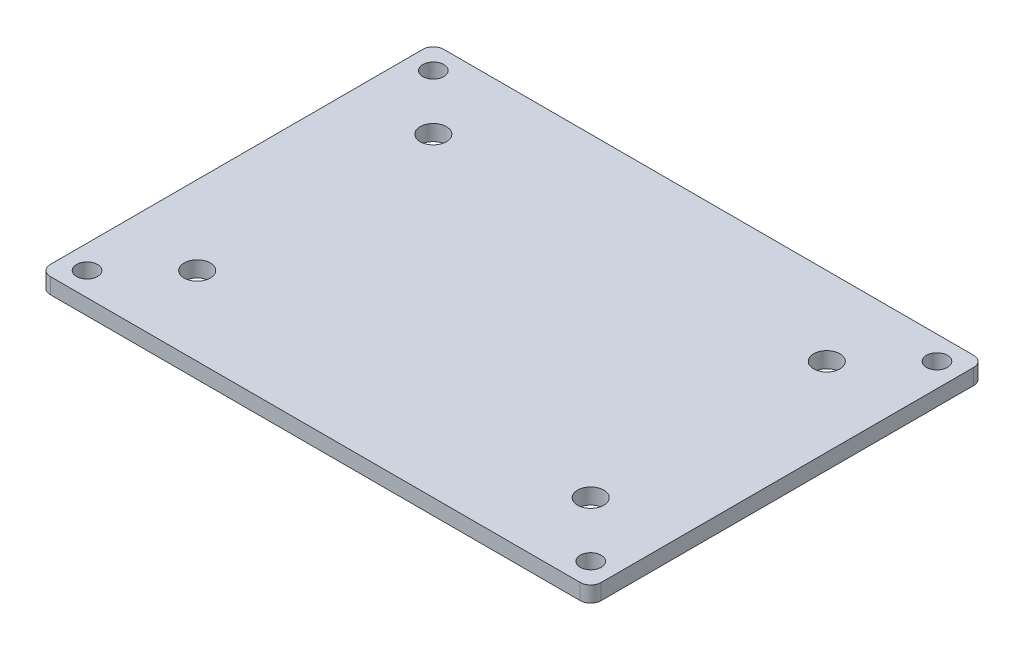
ISO-10303-21;
HEADER;
FILE_DESCRIPTION(('STEP AP214'),'2;1');
FILE_NAME('part.step','',(''),(''),'','','');
FILE_SCHEMA(('AUTOMOTIVE_DESIGN { 1 0 10303 214 1 1 1 1 }'));
ENDSEC;
DATA;
#1=APPLICATION_CONTEXT('core data for automotive mechanical design processes');
#2=APPLICATION_PROTOCOL_DEFINITION('international standard','automotive_design',2000,#1);
#3=PRODUCT_CONTEXT('',#1,'mechanical');
#4=PRODUCT('Part','Part','',(#3));
#5=PRODUCT_RELATED_PRODUCT_CATEGORY('part','',(#4));
#6=PRODUCT_DEFINITION_FORMATION('','',#4);
#7=PRODUCT_DEFINITION_CONTEXT('part definition',#1,'design');
#8=PRODUCT_DEFINITION('design','',#6,#7);
#9=PRODUCT_DEFINITION_SHAPE('','',#8);
#10=(LENGTH_UNIT() NAMED_UNIT(*) SI_UNIT(.MILLI.,.METRE.));
#11=(NAMED_UNIT(*) PLANE_ANGLE_UNIT() SI_UNIT($,.RADIAN.));
#12=(NAMED_UNIT(*) SI_UNIT($,.STERADIAN.) SOLID_ANGLE_UNIT());
#13=UNCERTAINTY_MEASURE_WITH_UNIT(LENGTH_MEASURE(1.E-05),#10,'distance_accuracy_value','');
#14=(GEOMETRIC_REPRESENTATION_CONTEXT(3) GLOBAL_UNCERTAINTY_ASSIGNED_CONTEXT((#13)) GLOBAL_UNIT_ASSIGNED_CONTEXT((#10,
#11,#12)) REPRESENTATION_CONTEXT('',''));
#15=CARTESIAN_POINT('',(0.,0.,0.));
#16=DIRECTION('',(0.,0.,1.));
#17=DIRECTION('',(1.,0.,0.));
#18=AXIS2_PLACEMENT_3D('',#15,#16,#17);
#19=CARTESIAN_POINT('',(0.,3.,0.));
#20=DIRECTION('',(0.,-1.,0.));
#21=DIRECTION('',(0.,0.,-1.));
#22=AXIS2_PLACEMENT_3D('',#19,#20,#21);
#23=PLANE('',#22);
#24=CARTESIAN_POINT('',(-37.5,3.,-22.5));
#25=DIRECTION('',(0.,1.,0.));
#26=DIRECTION('',(0.,0.,1.));
#27=AXIS2_PLACEMENT_3D('',#24,#25,#26);
#28=CIRCLE('',#27,2.5);
#29=CARTESIAN_POINT('',(-37.5,3.,-20.));
#30=VERTEX_POINT('',#29);
#31=EDGE_CURVE('E431',#30,#30,#28,.T.);
#32=ORIENTED_EDGE('',*,*,#31,.F.);
#33=EDGE_LOOP('',(#32));
#34=FACE_BOUND('',#33,.T.);
#35=CARTESIAN_POINT('',(37.5,3.,-22.5));
#36=DIRECTION('',(0.,1.,0.));
#37=DIRECTION('',(0.,0.,1.));
#38=AXIS2_PLACEMENT_3D('',#35,#36,#37);
#39=CIRCLE('',#38,2.5);
#40=CARTESIAN_POINT('',(37.5,3.,-20.));
#41=VERTEX_POINT('',#40);
#42=EDGE_CURVE('E433',#41,#41,#39,.T.);
#43=ORIENTED_EDGE('',*,*,#42,.F.);
#44=EDGE_LOOP('',(#43));
#45=FACE_BOUND('',#44,.T.);
#46=CARTESIAN_POINT('',(37.5,3.,22.5));
#47=DIRECTION('',(0.,1.,0.));
#48=DIRECTION('',(0.,0.,1.));
#49=AXIS2_PLACEMENT_3D('',#46,#47,#48);
#50=CIRCLE('',#49,2.5);
#51=CARTESIAN_POINT('',(37.5,3.,25.));
#52=VERTEX_POINT('',#51);
#53=EDGE_CURVE('E437',#52,#52,#50,.T.);
#54=ORIENTED_EDGE('',*,*,#53,.F.);
#55=EDGE_LOOP('',(#54));
#56=FACE_BOUND('',#55,.T.);
#57=CARTESIAN_POINT('',(-37.5,3.,22.5));
#58=DIRECTION('',(0.,1.,0.));
#59=DIRECTION('',(0.,0.,1.));
#60=AXIS2_PLACEMENT_3D('',#57,#58,#59);
#61=CIRCLE('',#60,2.5);
#62=CARTESIAN_POINT('',(-37.5,3.,25.));
#63=VERTEX_POINT('',#62);
#64=EDGE_CURVE('E187',#63,#63,#61,.T.);
#65=ORIENTED_EDGE('',*,*,#64,.F.);
#66=EDGE_LOOP('',(#65));
#67=FACE_BOUND('',#66,.T.);
#68=DIRECTION('',(-1.,0.,0.));
#69=VECTOR('',#68,1.);
#70=CARTESIAN_POINT('',(-52.5,3.,-37.5));
#71=LINE('',#70,#69);
#72=CARTESIAN_POINT('',(50.5,3.,-37.5));
#73=VERTEX_POINT('',#72);
#74=CARTESIAN_POINT('',(-50.5,3.,-37.5));
#75=VERTEX_POINT('',#74);
#76=EDGE_CURVE('E238',#73,#75,#71,.T.);
#77=ORIENTED_EDGE('',*,*,#76,.T.);
#78=CARTESIAN_POINT('',(-50.5,3.,-35.5));
#79=DIRECTION('',(0.,-1.,0.));
#80=DIRECTION('',(0.,0.,-1.));
#81=AXIS2_PLACEMENT_3D('',#78,#79,#80);
#82=CIRCLE('',#81,2.);
#83=CARTESIAN_POINT('',(-52.5,3.,-35.5));
#84=VERTEX_POINT('',#83);
#85=EDGE_CURVE('E170',#75,#84,#82,.F.);
#86=ORIENTED_EDGE('',*,*,#85,.T.);
#87=DIRECTION('',(0.,0.,1.));
#88=VECTOR('',#87,1.);
#89=CARTESIAN_POINT('',(-52.5,3.,37.5));
#90=LINE('',#89,#88);
#91=CARTESIAN_POINT('',(-52.5,3.,35.5));
#92=VERTEX_POINT('',#91);
#93=EDGE_CURVE('E127',#84,#92,#90,.T.);
#94=ORIENTED_EDGE('',*,*,#93,.T.);
#95=CARTESIAN_POINT('',(-50.5,3.,35.5));
#96=DIRECTION('',(0.,-1.,0.));
#97=DIRECTION('',(0.,0.,-1.));
#98=AXIS2_PLACEMENT_3D('',#95,#96,#97);
#99=CIRCLE('',#98,2.);
#100=CARTESIAN_POINT('',(-50.5,3.,37.5));
#101=VERTEX_POINT('',#100);
#102=EDGE_CURVE('E63',#92,#101,#99,.F.);
#103=ORIENTED_EDGE('',*,*,#102,.T.);
#104=DIRECTION('',(1.,0.,0.));
#105=VECTOR('',#104,1.);
#106=CARTESIAN_POINT('',(-52.5,3.,37.5));
#107=LINE('',#106,#105);
#108=CARTESIAN_POINT('',(50.5,3.,37.5));
#109=VERTEX_POINT('',#108);
#110=EDGE_CURVE('E148',#101,#109,#107,.T.);
#111=ORIENTED_EDGE('',*,*,#110,.T.);
#112=CARTESIAN_POINT('',(50.5,3.,35.5));
#113=DIRECTION('',(0.,-1.,0.));
#114=DIRECTION('',(0.,0.,-1.));
#115=AXIS2_PLACEMENT_3D('',#112,#113,#114);
#116=CIRCLE('',#115,2.);
#117=CARTESIAN_POINT('',(52.5,3.,35.5));
#118=VERTEX_POINT('',#117);
#119=EDGE_CURVE('E162',#109,#118,#116,.F.);
#120=ORIENTED_EDGE('',*,*,#119,.T.);
#121=DIRECTION('',(0.,0.,-1.));
#122=VECTOR('',#121,1.);
#123=CARTESIAN_POINT('',(52.5,3.,37.5));
#124=LINE('',#123,#122);
#125=CARTESIAN_POINT('',(52.5,3.,-35.5));
#126=VERTEX_POINT('',#125);
#127=EDGE_CURVE('E141',#118,#126,#124,.T.);
#128=ORIENTED_EDGE('',*,*,#127,.T.);
#129=CARTESIAN_POINT('',(50.5,3.,-35.5));
#130=DIRECTION('',(0.,-1.,0.));
#131=DIRECTION('',(0.,0.,-1.));
#132=AXIS2_PLACEMENT_3D('',#129,#130,#131);
#133=CIRCLE('',#132,2.);
#134=EDGE_CURVE('E165',#126,#73,#133,.F.);
#135=ORIENTED_EDGE('',*,*,#134,.T.);
#136=EDGE_LOOP('',(#77,#86,#94,#103,#111,#120,#128,#135));
#137=FACE_BOUND('',#136,.T.);
#138=CARTESIAN_POINT('',(-48.,3.,-33.));
#139=DIRECTION('',(0.,1.,0.));
#140=DIRECTION('',(0.,0.,1.));
#141=AXIS2_PLACEMENT_3D('',#138,#139,#140);
#142=CIRCLE('',#141,2.);
#143=CARTESIAN_POINT('',(-48.,3.,-31.));
#144=VERTEX_POINT('',#143);
#145=EDGE_CURVE('E228',#144,#144,#142,.T.);
#146=ORIENTED_EDGE('',*,*,#145,.F.);
#147=EDGE_LOOP('',(#146));
#148=FACE_BOUND('',#147,.T.);
#149=CARTESIAN_POINT('',(-48.,3.,33.));
#150=DIRECTION('',(0.,1.,0.));
#151=DIRECTION('',(0.,0.,1.));
#152=AXIS2_PLACEMENT_3D('',#149,#150,#151);
#153=CIRCLE('',#152,2.);
#154=CARTESIAN_POINT('',(-48.,3.,35.));
#155=VERTEX_POINT('',#154);
#156=EDGE_CURVE('E220',#155,#155,#153,.T.);
#157=ORIENTED_EDGE('',*,*,#156,.F.);
#158=EDGE_LOOP('',(#157));
#159=FACE_BOUND('',#158,.T.);
#160=CARTESIAN_POINT('',(48.,3.,33.));
#161=DIRECTION('',(0.,1.,0.));
#162=DIRECTION('',(0.,0.,1.));
#163=AXIS2_PLACEMENT_3D('',#160,#161,#162);
#164=CIRCLE('',#163,2.);
#165=CARTESIAN_POINT('',(48.,3.,35.));
#166=VERTEX_POINT('',#165);
#167=EDGE_CURVE('E212',#166,#166,#164,.T.);
#168=ORIENTED_EDGE('',*,*,#167,.F.);
#169=EDGE_LOOP('',(#168));
#170=FACE_BOUND('',#169,.T.);
#171=CARTESIAN_POINT('',(48.,3.,-33.));
#172=DIRECTION('',(0.,1.,0.));
#173=DIRECTION('',(0.,0.,1.));
#174=AXIS2_PLACEMENT_3D('',#171,#172,#173);
#175=CIRCLE('',#174,2.);
#176=CARTESIAN_POINT('',(48.,3.,-31.));
#177=VERTEX_POINT('',#176);
#178=EDGE_CURVE('E202',#177,#177,#175,.T.);
#179=ORIENTED_EDGE('',*,*,#178,.F.);
#180=EDGE_LOOP('',(#179));
#181=FACE_BOUND('',#180,.T.);
#182=ADVANCED_FACE('F38',(#34,#45,#56,#67,#137,#148,#159,#170,#181),#23,.F.);
#183=CARTESIAN_POINT('',(0.,0.,0.));
#184=DIRECTION('',(0.,-1.,0.));
#185=DIRECTION('',(0.,0.,-1.));
#186=AXIS2_PLACEMENT_3D('',#183,#184,#185);
#187=PLANE('',#186);
#188=CARTESIAN_POINT('',(-37.5,0.,-22.5));
#189=DIRECTION('',(0.,-1.,0.));
#190=DIRECTION('',(0.,0.,-1.));
#191=AXIS2_PLACEMENT_3D('',#188,#189,#190);
#192=CIRCLE('',#191,2.5);
#193=CARTESIAN_POINT('',(-37.5,0.,-25.));
#194=VERTEX_POINT('',#193);
#195=EDGE_CURVE('E42',#194,#194,#192,.T.);
#196=ORIENTED_EDGE('',*,*,#195,.F.);
#197=EDGE_LOOP('',(#196));
#198=FACE_BOUND('',#197,.T.);
#199=CARTESIAN_POINT('',(37.5,0.,-22.5));
#200=DIRECTION('',(0.,-1.,0.));
#201=DIRECTION('',(0.,0.,-1.));
#202=AXIS2_PLACEMENT_3D('',#199,#200,#201);
#203=CIRCLE('',#202,2.5);
#204=CARTESIAN_POINT('',(37.5,0.,-25.));
#205=VERTEX_POINT('',#204);
#206=EDGE_CURVE('E190',#205,#205,#203,.T.);
#207=ORIENTED_EDGE('',*,*,#206,.F.);
#208=EDGE_LOOP('',(#207));
#209=FACE_BOUND('',#208,.T.);
#210=CARTESIAN_POINT('',(37.5,0.,22.5));
#211=DIRECTION('',(0.,-1.,0.));
#212=DIRECTION('',(0.,0.,-1.));
#213=AXIS2_PLACEMENT_3D('',#210,#211,#212);
#214=CIRCLE('',#213,2.5);
#215=CARTESIAN_POINT('',(37.5,0.,20.));
#216=VERTEX_POINT('',#215);
#217=EDGE_CURVE('E186',#216,#216,#214,.T.);
#218=ORIENTED_EDGE('',*,*,#217,.F.);
#219=EDGE_LOOP('',(#218));
#220=FACE_BOUND('',#219,.T.);
#221=CARTESIAN_POINT('',(-37.5,0.,22.5));
#222=DIRECTION('',(0.,-1.,0.));
#223=DIRECTION('',(0.,0.,-1.));
#224=AXIS2_PLACEMENT_3D('',#221,#222,#223);
#225=CIRCLE('',#224,2.5);
#226=CARTESIAN_POINT('',(-37.5,0.,20.));
#227=VERTEX_POINT('',#226);
#228=EDGE_CURVE('E182',#227,#227,#225,.T.);
#229=ORIENTED_EDGE('',*,*,#228,.F.);
#230=EDGE_LOOP('',(#229));
#231=FACE_BOUND('',#230,.T.);
#232=CARTESIAN_POINT('',(48.,0.,33.));
#233=DIRECTION('',(0.,1.,0.));
#234=DIRECTION('',(0.,0.,1.));
#235=AXIS2_PLACEMENT_3D('',#232,#233,#234);
#236=CIRCLE('',#235,2.);
#237=CARTESIAN_POINT('',(48.,0.,35.));
#238=VERTEX_POINT('',#237);
#239=EDGE_CURVE('E208',#238,#238,#236,.T.);
#240=ORIENTED_EDGE('',*,*,#239,.T.);
#241=EDGE_LOOP('',(#240));
#242=FACE_BOUND('',#241,.T.);
#243=CARTESIAN_POINT('',(-48.,0.,-33.));
#244=DIRECTION('',(0.,1.,0.));
#245=DIRECTION('',(0.,0.,1.));
#246=AXIS2_PLACEMENT_3D('',#243,#244,#245);
#247=CIRCLE('',#246,2.);
#248=CARTESIAN_POINT('',(-48.,0.,-31.));
#249=VERTEX_POINT('',#248);
#250=EDGE_CURVE('E224',#249,#249,#247,.T.);
#251=ORIENTED_EDGE('',*,*,#250,.T.);
#252=EDGE_LOOP('',(#251));
#253=FACE_BOUND('',#252,.T.);
#254=DIRECTION('',(0.,0.,1.));
#255=VECTOR('',#254,1.);
#256=CARTESIAN_POINT('',(-52.5,0.,37.5));
#257=LINE('',#256,#255);
#258=CARTESIAN_POINT('',(-52.5,0.,-35.5));
#259=VERTEX_POINT('',#258);
#260=CARTESIAN_POINT('',(-52.5,0.,35.5));
#261=VERTEX_POINT('',#260);
#262=EDGE_CURVE('E125',#259,#261,#257,.T.);
#263=ORIENTED_EDGE('',*,*,#262,.F.);
#264=CARTESIAN_POINT('',(-50.5,0.,-35.5));
#265=DIRECTION('',(0.,-1.,0.));
#266=DIRECTION('',(0.,0.,-1.));
#267=AXIS2_PLACEMENT_3D('',#264,#265,#266);
#268=CIRCLE('',#267,2.);
#269=CARTESIAN_POINT('',(-50.5,0.,-37.5));
#270=VERTEX_POINT('',#269);
#271=EDGE_CURVE('E107',#259,#270,#268,.T.);
#272=ORIENTED_EDGE('',*,*,#271,.T.);
#273=DIRECTION('',(-1.,0.,0.));
#274=VECTOR('',#273,1.);
#275=CARTESIAN_POINT('',(-52.5,0.,-37.5));
#276=LINE('',#275,#274);
#277=CARTESIAN_POINT('',(50.5,0.,-37.5));
#278=VERTEX_POINT('',#277);
#279=EDGE_CURVE('E137',#278,#270,#276,.T.);
#280=ORIENTED_EDGE('',*,*,#279,.F.);
#281=CARTESIAN_POINT('',(50.5,0.,-35.5));
#282=DIRECTION('',(0.,-1.,0.));
#283=DIRECTION('',(0.,0.,-1.));
#284=AXIS2_PLACEMENT_3D('',#281,#282,#283);
#285=CIRCLE('',#284,2.);
#286=CARTESIAN_POINT('',(52.5,0.,-35.5));
#287=VERTEX_POINT('',#286);
#288=EDGE_CURVE('E152',#278,#287,#285,.T.);
#289=ORIENTED_EDGE('',*,*,#288,.T.);
#290=DIRECTION('',(0.,0.,-1.));
#291=VECTOR('',#290,1.);
#292=CARTESIAN_POINT('',(52.5,0.,37.5));
#293=LINE('',#292,#291);
#294=CARTESIAN_POINT('',(52.5,0.,35.5));
#295=VERTEX_POINT('',#294);
#296=EDGE_CURVE('E143',#295,#287,#293,.T.);
#297=ORIENTED_EDGE('',*,*,#296,.F.);
#298=CARTESIAN_POINT('',(50.5,0.,35.5));
#299=DIRECTION('',(0.,-1.,0.));
#300=DIRECTION('',(0.,0.,-1.));
#301=AXIS2_PLACEMENT_3D('',#298,#299,#300);
#302=CIRCLE('',#301,2.);
#303=CARTESIAN_POINT('',(50.5,0.,37.5));
#304=VERTEX_POINT('',#303);
#305=EDGE_CURVE('E129',#295,#304,#302,.T.);
#306=ORIENTED_EDGE('',*,*,#305,.T.);
#307=DIRECTION('',(1.,0.,0.));
#308=VECTOR('',#307,1.);
#309=CARTESIAN_POINT('',(-52.5,0.,37.5));
#310=LINE('',#309,#308);
#311=CARTESIAN_POINT('',(-50.5,0.,37.5));
#312=VERTEX_POINT('',#311);
#313=EDGE_CURVE('E136',#312,#304,#310,.T.);
#314=ORIENTED_EDGE('',*,*,#313,.F.);
#315=CARTESIAN_POINT('',(-50.5,0.,35.5));
#316=DIRECTION('',(0.,-1.,0.));
#317=DIRECTION('',(0.,0.,-1.));
#318=AXIS2_PLACEMENT_3D('',#315,#316,#317);
#319=CIRCLE('',#318,2.);
#320=EDGE_CURVE('E119',#312,#261,#319,.T.);
#321=ORIENTED_EDGE('',*,*,#320,.T.);
#322=EDGE_LOOP('',(#263,#272,#280,#289,#297,#306,#314,#321));
#323=FACE_BOUND('',#322,.T.);
#324=CARTESIAN_POINT('',(-48.,0.,33.));
#325=DIRECTION('',(0.,1.,0.));
#326=DIRECTION('',(0.,0.,1.));
#327=AXIS2_PLACEMENT_3D('',#324,#325,#326);
#328=CIRCLE('',#327,2.);
#329=CARTESIAN_POINT('',(-48.,0.,35.));
#330=VERTEX_POINT('',#329);
#331=EDGE_CURVE('E216',#330,#330,#328,.T.);
#332=ORIENTED_EDGE('',*,*,#331,.T.);
#333=EDGE_LOOP('',(#332));
#334=FACE_BOUND('',#333,.T.);
#335=CARTESIAN_POINT('',(48.,0.,-33.));
#336=DIRECTION('',(0.,1.,0.));
#337=DIRECTION('',(0.,0.,1.));
#338=AXIS2_PLACEMENT_3D('',#335,#336,#337);
#339=CIRCLE('',#338,2.);
#340=CARTESIAN_POINT('',(48.,0.,-31.));
#341=VERTEX_POINT('',#340);
#342=EDGE_CURVE('E197',#341,#341,#339,.T.);
#343=ORIENTED_EDGE('',*,*,#342,.T.);
#344=EDGE_LOOP('',(#343));
#345=FACE_BOUND('',#344,.T.);
#346=ADVANCED_FACE('F132',(#198,#209,#220,#231,#242,#253,#323,#334,#345),#187,.T.);
#347=CARTESIAN_POINT('',(52.5,3.,37.5));
#348=DIRECTION('',(-1.,0.,0.));
#349=DIRECTION('',(0.,0.,1.));
#350=AXIS2_PLACEMENT_3D('',#347,#348,#349);
#351=PLANE('',#350);
#352=ORIENTED_EDGE('',*,*,#296,.T.);
#353=DIRECTION('',(0.,-1.,0.));
#354=VECTOR('',#353,1.);
#355=CARTESIAN_POINT('',(52.5,3.,-35.5));
#356=LINE('',#355,#354);
#357=EDGE_CURVE('E11',#287,#126,#356,.F.);
#358=ORIENTED_EDGE('',*,*,#357,.T.);
#359=ORIENTED_EDGE('',*,*,#127,.F.);
#360=DIRECTION('',(0.,-1.,0.));
#361=VECTOR('',#360,1.);
#362=CARTESIAN_POINT('',(52.5,3.,35.5));
#363=LINE('',#362,#361);
#364=EDGE_CURVE('E48',#118,#295,#363,.T.);
#365=ORIENTED_EDGE('',*,*,#364,.T.);
#366=EDGE_LOOP('',(#352,#358,#359,#365));
#367=FACE_BOUND('',#366,.T.);
#368=ADVANCED_FACE('F250',(#367),#351,.F.);
#369=CARTESIAN_POINT('',(-52.5,3.,-37.5));
#370=DIRECTION('',(0.,0.,1.));
#371=DIRECTION('',(1.,0.,0.));
#372=AXIS2_PLACEMENT_3D('',#369,#370,#371);
#373=PLANE('',#372);
#374=ORIENTED_EDGE('',*,*,#279,.T.);
#375=DIRECTION('',(0.,-1.,0.));
#376=VECTOR('',#375,1.);
#377=CARTESIAN_POINT('',(-50.5,3.,-37.5));
#378=LINE('',#377,#376);
#379=EDGE_CURVE('E112',#270,#75,#378,.F.);
#380=ORIENTED_EDGE('',*,*,#379,.T.);
#381=ORIENTED_EDGE('',*,*,#76,.F.);
#382=DIRECTION('',(0.,-1.,0.));
#383=VECTOR('',#382,1.);
#384=CARTESIAN_POINT('',(50.5,3.,-37.5));
#385=LINE('',#384,#383);
#386=EDGE_CURVE('E118',#73,#278,#385,.T.);
#387=ORIENTED_EDGE('',*,*,#386,.T.);
#388=EDGE_LOOP('',(#374,#380,#381,#387));
#389=FACE_BOUND('',#388,.T.);
#390=ADVANCED_FACE('F260',(#389),#373,.F.);
#391=CARTESIAN_POINT('',(-52.5,3.,37.5));
#392=DIRECTION('',(1.,0.,0.));
#393=DIRECTION('',(0.,0.,-1.));
#394=AXIS2_PLACEMENT_3D('',#391,#392,#393);
#395=PLANE('',#394);
#396=ORIENTED_EDGE('',*,*,#93,.F.);
#397=DIRECTION('',(0.,-1.,0.));
#398=VECTOR('',#397,1.);
#399=CARTESIAN_POINT('',(-52.5,3.,-35.5));
#400=LINE('',#399,#398);
#401=EDGE_CURVE('E111',#84,#259,#400,.T.);
#402=ORIENTED_EDGE('',*,*,#401,.T.);
#403=ORIENTED_EDGE('',*,*,#262,.T.);
#404=DIRECTION('',(0.,-1.,0.));
#405=VECTOR('',#404,1.);
#406=CARTESIAN_POINT('',(-52.5,3.,35.5));
#407=LINE('',#406,#405);
#408=EDGE_CURVE('E130',#261,#92,#407,.F.);
#409=ORIENTED_EDGE('',*,*,#408,.T.);
#410=EDGE_LOOP('',(#396,#402,#403,#409));
#411=FACE_BOUND('',#410,.T.);
#412=ADVANCED_FACE('F124',(#411),#395,.F.);
#413=CARTESIAN_POINT('',(-52.5,3.,37.5));
#414=DIRECTION('',(0.,0.,-1.));
#415=DIRECTION('',(-1.,0.,0.));
#416=AXIS2_PLACEMENT_3D('',#413,#414,#415);
#417=PLANE('',#416);
#418=ORIENTED_EDGE('',*,*,#110,.F.);
#419=DIRECTION('',(0.,-1.,0.));
#420=VECTOR('',#419,1.);
#421=CARTESIAN_POINT('',(-50.5,3.,37.5));
#422=LINE('',#421,#420);
#423=EDGE_CURVE('E175',#101,#312,#422,.T.);
#424=ORIENTED_EDGE('',*,*,#423,.T.);
#425=ORIENTED_EDGE('',*,*,#313,.T.);
#426=DIRECTION('',(0.,-1.,0.));
#427=VECTOR('',#426,1.);
#428=CARTESIAN_POINT('',(50.5,3.,37.5));
#429=LINE('',#428,#427);
#430=EDGE_CURVE('E56',#304,#109,#429,.F.);
#431=ORIENTED_EDGE('',*,*,#430,.T.);
#432=EDGE_LOOP('',(#418,#424,#425,#431));
#433=FACE_BOUND('',#432,.T.);
#434=ADVANCED_FACE('F267',(#433),#417,.F.);
#435=CARTESIAN_POINT('',(-48.,3.,-33.));
#436=DIRECTION('',(0.,-1.,0.));
#437=DIRECTION('',(0.,0.,-1.));
#438=AXIS2_PLACEMENT_3D('',#435,#436,#437);
#439=CYLINDRICAL_SURFACE('',#438,2.);
#440=ORIENTED_EDGE('',*,*,#145,.T.);
#441=EDGE_LOOP('',(#440));
#442=FACE_BOUND('',#441,.T.);
#443=ORIENTED_EDGE('',*,*,#250,.F.);
#444=EDGE_LOOP('',(#443));
#445=FACE_BOUND('',#444,.T.);
#446=ADVANCED_FACE('F282',(#442,#445),#439,.F.);
#447=CARTESIAN_POINT('',(-48.,3.,33.));
#448=DIRECTION('',(0.,-1.,0.));
#449=DIRECTION('',(0.,0.,-1.));
#450=AXIS2_PLACEMENT_3D('',#447,#448,#449);
#451=CYLINDRICAL_SURFACE('',#450,2.);
#452=ORIENTED_EDGE('',*,*,#156,.T.);
#453=EDGE_LOOP('',(#452));
#454=FACE_BOUND('',#453,.T.);
#455=ORIENTED_EDGE('',*,*,#331,.F.);
#456=EDGE_LOOP('',(#455));
#457=FACE_BOUND('',#456,.T.);
#458=ADVANCED_FACE('F289',(#454,#457),#451,.F.);
#459=CARTESIAN_POINT('',(48.,3.,33.));
#460=DIRECTION('',(0.,-1.,0.));
#461=DIRECTION('',(0.,0.,-1.));
#462=AXIS2_PLACEMENT_3D('',#459,#460,#461);
#463=CYLINDRICAL_SURFACE('',#462,2.);
#464=ORIENTED_EDGE('',*,*,#167,.T.);
#465=EDGE_LOOP('',(#464));
#466=FACE_BOUND('',#465,.T.);
#467=ORIENTED_EDGE('',*,*,#239,.F.);
#468=EDGE_LOOP('',(#467));
#469=FACE_BOUND('',#468,.T.);
#470=ADVANCED_FACE('F306',(#466,#469),#463,.F.);
#471=CARTESIAN_POINT('',(48.,3.,-33.));
#472=DIRECTION('',(0.,-1.,0.));
#473=DIRECTION('',(0.,0.,-1.));
#474=AXIS2_PLACEMENT_3D('',#471,#472,#473);
#475=CYLINDRICAL_SURFACE('',#474,2.);
#476=ORIENTED_EDGE('',*,*,#178,.T.);
#477=EDGE_LOOP('',(#476));
#478=FACE_BOUND('',#477,.T.);
#479=ORIENTED_EDGE('',*,*,#342,.F.);
#480=EDGE_LOOP('',(#479));
#481=FACE_BOUND('',#480,.T.);
#482=ADVANCED_FACE('F301',(#478,#481),#475,.F.);
#483=CARTESIAN_POINT('',(-50.5,3.,-35.5));
#484=DIRECTION('',(0.,-1.,0.));
#485=DIRECTION('',(0.,0.,-1.));
#486=AXIS2_PLACEMENT_3D('',#483,#484,#485);
#487=CYLINDRICAL_SURFACE('',#486,2.);
#488=ORIENTED_EDGE('',*,*,#85,.F.);
#489=ORIENTED_EDGE('',*,*,#379,.F.);
#490=ORIENTED_EDGE('',*,*,#271,.F.);
#491=ORIENTED_EDGE('',*,*,#401,.F.);
#492=EDGE_LOOP('',(#488,#489,#490,#491));
#493=FACE_BOUND('',#492,.T.);
#494=ADVANCED_FACE('F110',(#493),#487,.T.);
#495=CARTESIAN_POINT('',(-50.5,3.,35.5));
#496=DIRECTION('',(0.,-1.,0.));
#497=DIRECTION('',(0.,0.,-1.));
#498=AXIS2_PLACEMENT_3D('',#495,#496,#497);
#499=CYLINDRICAL_SURFACE('',#498,2.);
#500=ORIENTED_EDGE('',*,*,#102,.F.);
#501=ORIENTED_EDGE('',*,*,#408,.F.);
#502=ORIENTED_EDGE('',*,*,#320,.F.);
#503=ORIENTED_EDGE('',*,*,#423,.F.);
#504=EDGE_LOOP('',(#500,#501,#502,#503));
#505=FACE_BOUND('',#504,.T.);
#506=ADVANCED_FACE('F294',(#505),#499,.T.);
#507=CARTESIAN_POINT('',(50.5,3.,-35.5));
#508=DIRECTION('',(0.,-1.,0.));
#509=DIRECTION('',(0.,0.,-1.));
#510=AXIS2_PLACEMENT_3D('',#507,#508,#509);
#511=CYLINDRICAL_SURFACE('',#510,2.);
#512=ORIENTED_EDGE('',*,*,#134,.F.);
#513=ORIENTED_EDGE('',*,*,#357,.F.);
#514=ORIENTED_EDGE('',*,*,#288,.F.);
#515=ORIENTED_EDGE('',*,*,#386,.F.);
#516=EDGE_LOOP('',(#512,#513,#514,#515));
#517=FACE_BOUND('',#516,.T.);
#518=ADVANCED_FACE('F255',(#517),#511,.T.);
#519=CARTESIAN_POINT('',(50.5,3.,35.5));
#520=DIRECTION('',(0.,-1.,0.));
#521=DIRECTION('',(0.,0.,-1.));
#522=AXIS2_PLACEMENT_3D('',#519,#520,#521);
#523=CYLINDRICAL_SURFACE('',#522,2.);
#524=ORIENTED_EDGE('',*,*,#119,.F.);
#525=ORIENTED_EDGE('',*,*,#430,.F.);
#526=ORIENTED_EDGE('',*,*,#305,.F.);
#527=ORIENTED_EDGE('',*,*,#364,.F.);
#528=EDGE_LOOP('',(#524,#525,#526,#527));
#529=FACE_BOUND('',#528,.T.);
#530=ADVANCED_FACE('F40',(#529),#523,.T.);
#531=CARTESIAN_POINT('',(-37.5,-7.,22.5));
#532=DIRECTION('',(0.,1.,0.));
#533=DIRECTION('',(0.,0.,1.));
#534=AXIS2_PLACEMENT_3D('',#531,#532,#533);
#535=CYLINDRICAL_SURFACE('',#534,2.5);
#536=ORIENTED_EDGE('',*,*,#228,.T.);
#537=EDGE_LOOP('',(#536));
#538=FACE_BOUND('',#537,.T.);
#539=ORIENTED_EDGE('',*,*,#64,.T.);
#540=EDGE_LOOP('',(#539));
#541=FACE_BOUND('',#540,.T.);
#542=ADVANCED_FACE('F316',(#538,#541),#535,.F.);
#543=CARTESIAN_POINT('',(37.5,-7.,22.5));
#544=DIRECTION('',(0.,1.,0.));
#545=DIRECTION('',(0.,0.,1.));
#546=AXIS2_PLACEMENT_3D('',#543,#544,#545);
#547=CYLINDRICAL_SURFACE('',#546,2.5);
#548=ORIENTED_EDGE('',*,*,#217,.T.);
#549=EDGE_LOOP('',(#548));
#550=FACE_BOUND('',#549,.T.);
#551=ORIENTED_EDGE('',*,*,#53,.T.);
#552=EDGE_LOOP('',(#551));
#553=FACE_BOUND('',#552,.T.);
#554=ADVANCED_FACE('F399',(#550,#553),#547,.F.);
#555=CARTESIAN_POINT('',(37.5,-7.,-22.5));
#556=DIRECTION('',(0.,1.,0.));
#557=DIRECTION('',(0.,0.,1.));
#558=AXIS2_PLACEMENT_3D('',#555,#556,#557);
#559=CYLINDRICAL_SURFACE('',#558,2.5);
#560=ORIENTED_EDGE('',*,*,#206,.T.);
#561=EDGE_LOOP('',(#560));
#562=FACE_BOUND('',#561,.T.);
#563=ORIENTED_EDGE('',*,*,#42,.T.);
#564=EDGE_LOOP('',(#563));
#565=FACE_BOUND('',#564,.T.);
#566=ADVANCED_FACE('F405',(#562,#565),#559,.F.);
#567=CARTESIAN_POINT('',(-37.5,-7.,-22.5));
#568=DIRECTION('',(0.,1.,0.));
#569=DIRECTION('',(0.,0.,1.));
#570=AXIS2_PLACEMENT_3D('',#567,#568,#569);
#571=CYLINDRICAL_SURFACE('',#570,2.5);
#572=ORIENTED_EDGE('',*,*,#195,.T.);
#573=EDGE_LOOP('',(#572));
#574=FACE_BOUND('',#573,.T.);
#575=ORIENTED_EDGE('',*,*,#31,.T.);
#576=EDGE_LOOP('',(#575));
#577=FACE_BOUND('',#576,.T.);
#578=ADVANCED_FACE('F413',(#574,#577),#571,.F.);
#579=CLOSED_SHELL('',(#182,#346,#368,#390,#412,#434,#446,#458,#470,#482,#494,#506,#518,#530,
#542,#554,#566,#578));
#580=MANIFOLD_SOLID_BREP('B2',#579);
#581=ADVANCED_BREP_SHAPE_REPRESENTATION('',(#18,#580),#14);
#582=SHAPE_DEFINITION_REPRESENTATION(#9,#581);
ENDSEC;
END-ISO-10303-21;
